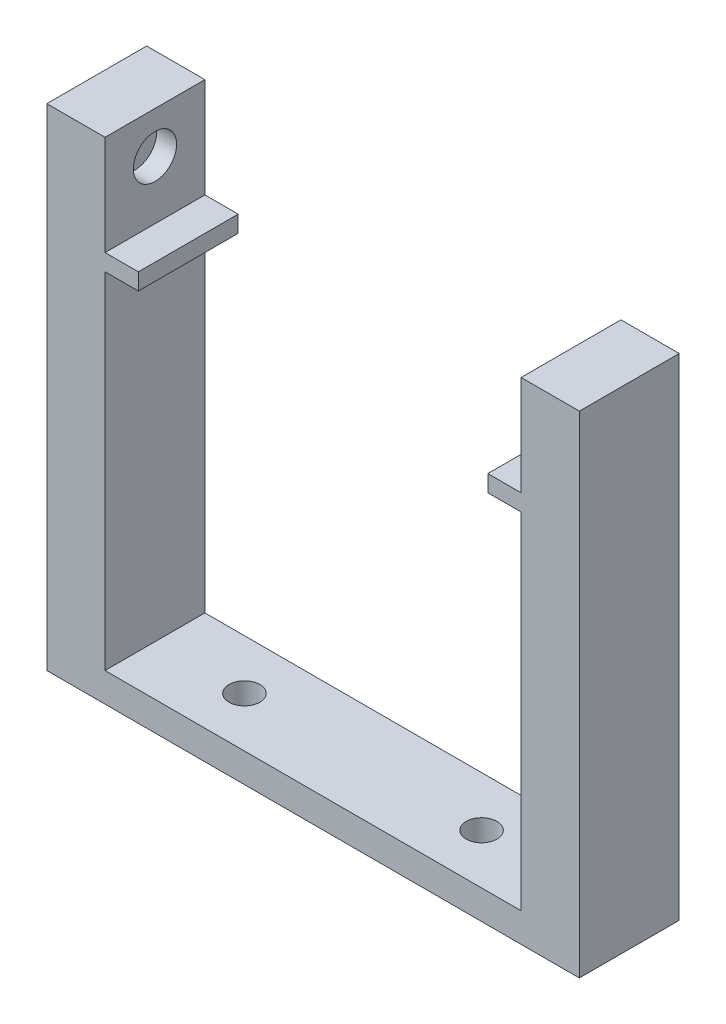
ISO-10303-21;
HEADER;
FILE_DESCRIPTION(('STEP AP214'),'2;1');
FILE_NAME('part.step','',(''),(''),'','','');
FILE_SCHEMA(('AUTOMOTIVE_DESIGN { 1 0 10303 214 1 1 1 1 }'));
ENDSEC;
DATA;
#1=APPLICATION_CONTEXT('core data for automotive mechanical design processes');
#2=APPLICATION_PROTOCOL_DEFINITION('international standard','automotive_design',2000,#1);
#3=PRODUCT_CONTEXT('',#1,'mechanical');
#4=PRODUCT('Part','Part','',(#3));
#5=PRODUCT_RELATED_PRODUCT_CATEGORY('part','',(#4));
#6=PRODUCT_DEFINITION_FORMATION('','',#4);
#7=PRODUCT_DEFINITION_CONTEXT('part definition',#1,'design');
#8=PRODUCT_DEFINITION('design','',#6,#7);
#9=PRODUCT_DEFINITION_SHAPE('','',#8);
#10=(LENGTH_UNIT() NAMED_UNIT(*) SI_UNIT(.MILLI.,.METRE.));
#11=(NAMED_UNIT(*) PLANE_ANGLE_UNIT() SI_UNIT($,.RADIAN.));
#12=(NAMED_UNIT(*) SI_UNIT($,.STERADIAN.) SOLID_ANGLE_UNIT());
#13=UNCERTAINTY_MEASURE_WITH_UNIT(LENGTH_MEASURE(1.E-05),#10,'distance_accuracy_value','');
#14=(GEOMETRIC_REPRESENTATION_CONTEXT(3) GLOBAL_UNCERTAINTY_ASSIGNED_CONTEXT((#13)) GLOBAL_UNIT_ASSIGNED_CONTEXT((#10,
#11,#12)) REPRESENTATION_CONTEXT('',''));
#15=CARTESIAN_POINT('',(0.,0.,0.));
#16=DIRECTION('',(0.,0.,1.));
#17=DIRECTION('',(1.,0.,0.));
#18=AXIS2_PLACEMENT_3D('',#15,#16,#17);
#19=CARTESIAN_POINT('',(7.,3.50000000000001,12.));
#20=DIRECTION('',(1.,0.,0.));
#21=DIRECTION('',(0.,0.,-1.));
#22=AXIS2_PLACEMENT_3D('',#19,#20,#21);
#23=PLANE('',#22);
#24=DIRECTION('',(0.,0.,-1.));
#25=VECTOR('',#24,1.);
#26=CARTESIAN_POINT('',(7.00000000000001,47.,0.));
#27=LINE('',#26,#25);
#28=CARTESIAN_POINT('',(7.,47.,12.));
#29=VERTEX_POINT('',#28);
#30=CARTESIAN_POINT('',(7.,47.,0.));
#31=VERTEX_POINT('',#30);
#32=EDGE_CURVE('E53',#29,#31,#27,.T.);
#33=ORIENTED_EDGE('',*,*,#32,.T.);
#34=DIRECTION('',(0.,-1.,0.));
#35=VECTOR('',#34,1.);
#36=CARTESIAN_POINT('',(7.,3.50000000000001,0.));
#37=LINE('',#36,#35);
#38=CARTESIAN_POINT('',(7.,59.,0.));
#39=VERTEX_POINT('',#38);
#40=EDGE_CURVE('E158',#39,#31,#37,.T.);
#41=ORIENTED_EDGE('',*,*,#40,.F.);
#42=DIRECTION('',(0.,0.,-1.));
#43=VECTOR('',#42,1.);
#44=CARTESIAN_POINT('',(7.,59.,0.));
#45=LINE('',#44,#43);
#46=CARTESIAN_POINT('',(7.,59.,12.));
#47=VERTEX_POINT('',#46);
#48=EDGE_CURVE('E225',#47,#39,#45,.T.);
#49=ORIENTED_EDGE('',*,*,#48,.F.);
#50=DIRECTION('',(0.,-1.,0.));
#51=VECTOR('',#50,1.);
#52=CARTESIAN_POINT('',(7.,3.50000000000001,12.));
#53=LINE('',#52,#51);
#54=EDGE_CURVE('E240',#47,#29,#53,.T.);
#55=ORIENTED_EDGE('',*,*,#54,.T.);
#56=EDGE_LOOP('',(#33,#41,#49,#55));
#57=FACE_BOUND('',#56,.T.);
#58=CARTESIAN_POINT('',(7.,54.,6.));
#59=DIRECTION('',(1.,0.,0.));
#60=DIRECTION('',(0.,0.,-1.));
#61=AXIS2_PLACEMENT_3D('',#58,#59,#60);
#62=CIRCLE('',#61,2.6);
#63=CARTESIAN_POINT('',(7.,54.,3.4));
#64=VERTEX_POINT('',#63);
#65=EDGE_CURVE('E214',#64,#64,#62,.T.);
#66=ORIENTED_EDGE('',*,*,#65,.F.);
#67=EDGE_LOOP('',(#66));
#68=FACE_BOUND('',#67,.T.);
#69=ADVANCED_FACE('F36',(#57,#68),#23,.T.);
#70=CARTESIAN_POINT('',(57.,3.5,12.));
#71=DIRECTION('',(-1.,0.,0.));
#72=DIRECTION('',(0.,0.,1.));
#73=AXIS2_PLACEMENT_3D('',#70,#71,#72);
#74=PLANE('',#73);
#75=DIRECTION('',(0.,1.,0.));
#76=VECTOR('',#75,1.);
#77=CARTESIAN_POINT('',(57.,3.5,12.));
#78=LINE('',#77,#76);
#79=CARTESIAN_POINT('',(57.,3.5,12.));
#80=VERTEX_POINT('',#79);
#81=CARTESIAN_POINT('',(57.,45.,12.));
#82=VERTEX_POINT('',#81);
#83=EDGE_CURVE('E235',#80,#82,#78,.T.);
#84=ORIENTED_EDGE('',*,*,#83,.T.);
#85=DIRECTION('',(0.,0.,1.));
#86=VECTOR('',#85,1.);
#87=CARTESIAN_POINT('',(57.,45.,0.));
#88=LINE('',#87,#86);
#89=CARTESIAN_POINT('',(57.,45.,0.));
#90=VERTEX_POINT('',#89);
#91=EDGE_CURVE('E161',#90,#82,#88,.T.);
#92=ORIENTED_EDGE('',*,*,#91,.F.);
#93=DIRECTION('',(0.,1.,0.));
#94=VECTOR('',#93,1.);
#95=CARTESIAN_POINT('',(57.,3.5,0.));
#96=LINE('',#95,#94);
#97=CARTESIAN_POINT('',(57.,3.5,0.));
#98=VERTEX_POINT('',#97);
#99=EDGE_CURVE('E245',#98,#90,#96,.T.);
#100=ORIENTED_EDGE('',*,*,#99,.F.);
#101=DIRECTION('',(0.,0.,-1.));
#102=VECTOR('',#101,1.);
#103=CARTESIAN_POINT('',(57.,3.5,12.));
#104=LINE('',#103,#102);
#105=EDGE_CURVE('E244',#80,#98,#104,.T.);
#106=ORIENTED_EDGE('',*,*,#105,.F.);
#107=EDGE_LOOP('',(#84,#92,#100,#106));
#108=FACE_BOUND('',#107,.T.);
#109=ADVANCED_FACE('F337',(#108),#74,.T.);
#110=CARTESIAN_POINT('',(57.,54.,6.));
#111=DIRECTION('',(1.,0.,0.));
#112=DIRECTION('',(0.,0.,-1.));
#113=AXIS2_PLACEMENT_3D('',#110,#111,#112);
#114=CIRCLE('',#113,2.6);
#115=CARTESIAN_POINT('',(57.,54.,3.4));
#116=VERTEX_POINT('',#115);
#117=EDGE_CURVE('E210',#116,#116,#114,.T.);
#118=ORIENTED_EDGE('',*,*,#117,.T.);
#119=EDGE_LOOP('',(#118));
#120=FACE_BOUND('',#119,.T.);
#121=CARTESIAN_POINT('',(57.,47.,0.));
#122=VERTEX_POINT('',#121);
#123=CARTESIAN_POINT('',(57.,59.,0.));
#124=VERTEX_POINT('',#123);
#125=EDGE_CURVE('E249',#122,#124,#96,.T.);
#126=ORIENTED_EDGE('',*,*,#125,.F.);
#127=DIRECTION('',(0.,0.,-1.));
#128=VECTOR('',#127,1.);
#129=CARTESIAN_POINT('',(57.,47.,0.));
#130=LINE('',#129,#128);
#131=CARTESIAN_POINT('',(57.,47.,12.));
#132=VERTEX_POINT('',#131);
#133=EDGE_CURVE('E192',#132,#122,#130,.T.);
#134=ORIENTED_EDGE('',*,*,#133,.F.);
#135=CARTESIAN_POINT('',(57.,59.,12.));
#136=VERTEX_POINT('',#135);
#137=EDGE_CURVE('E239',#132,#136,#78,.T.);
#138=ORIENTED_EDGE('',*,*,#137,.T.);
#139=DIRECTION('',(0.,0.,-1.));
#140=VECTOR('',#139,1.);
#141=CARTESIAN_POINT('',(57.,59.,0.));
#142=LINE('',#141,#140);
#143=EDGE_CURVE('E220',#136,#124,#142,.T.);
#144=ORIENTED_EDGE('',*,*,#143,.T.);
#145=EDGE_LOOP('',(#126,#134,#138,#144));
#146=FACE_BOUND('',#145,.T.);
#147=ADVANCED_FACE('F302',(#120,#146),#74,.T.);
#148=CARTESIAN_POINT('',(0.,0.,12.));
#149=DIRECTION('',(0.,0.,-1.));
#150=DIRECTION('',(-1.,0.,0.));
#151=AXIS2_PLACEMENT_3D('',#148,#149,#150);
#152=PLANE('',#151);
#153=ORIENTED_EDGE('',*,*,#54,.F.);
#154=DIRECTION('',(-1.,0.,0.));
#155=VECTOR('',#154,1.);
#156=CARTESIAN_POINT('',(0.,59.,12.));
#157=LINE('',#156,#155);
#158=CARTESIAN_POINT('',(0.,59.,12.));
#159=VERTEX_POINT('',#158);
#160=EDGE_CURVE('E268',#47,#159,#157,.T.);
#161=ORIENTED_EDGE('',*,*,#160,.T.);
#162=DIRECTION('',(0.,-1.,0.));
#163=VECTOR('',#162,1.);
#164=CARTESIAN_POINT('',(0.,0.,12.));
#165=LINE('',#164,#163);
#166=CARTESIAN_POINT('',(0.,0.,12.));
#167=VERTEX_POINT('',#166);
#168=EDGE_CURVE('E260',#159,#167,#165,.T.);
#169=ORIENTED_EDGE('',*,*,#168,.T.);
#170=DIRECTION('',(1.,0.,0.));
#171=VECTOR('',#170,1.);
#172=CARTESIAN_POINT('',(0.,0.,12.));
#173=LINE('',#172,#171);
#174=CARTESIAN_POINT('',(64.,0.,12.));
#175=VERTEX_POINT('',#174);
#176=EDGE_CURVE('E263',#167,#175,#173,.T.);
#177=ORIENTED_EDGE('',*,*,#176,.T.);
#178=DIRECTION('',(0.,1.,0.));
#179=VECTOR('',#178,1.);
#180=CARTESIAN_POINT('',(64.,0.,12.));
#181=LINE('',#180,#179);
#182=CARTESIAN_POINT('',(64.,59.,12.));
#183=VERTEX_POINT('',#182);
#184=EDGE_CURVE('E266',#175,#183,#181,.T.);
#185=ORIENTED_EDGE('',*,*,#184,.T.);
#186=EDGE_CURVE('E269',#183,#136,#157,.T.);
#187=ORIENTED_EDGE('',*,*,#186,.T.);
#188=ORIENTED_EDGE('',*,*,#137,.F.);
#189=DIRECTION('',(1.,0.,0.));
#190=VECTOR('',#189,1.);
#191=CARTESIAN_POINT('',(53.,47.,12.));
#192=LINE('',#191,#190);
#193=CARTESIAN_POINT('',(53.,47.,12.));
#194=VERTEX_POINT('',#193);
#195=EDGE_CURVE('E203',#194,#132,#192,.T.);
#196=ORIENTED_EDGE('',*,*,#195,.F.);
#197=DIRECTION('',(0.,1.,0.));
#198=VECTOR('',#197,1.);
#199=CARTESIAN_POINT('',(53.,47.,12.));
#200=LINE('',#199,#198);
#201=CARTESIAN_POINT('',(53.,45.,12.));
#202=VERTEX_POINT('',#201);
#203=EDGE_CURVE('E194',#202,#194,#200,.T.);
#204=ORIENTED_EDGE('',*,*,#203,.F.);
#205=DIRECTION('',(1.,0.,0.));
#206=VECTOR('',#205,1.);
#207=CARTESIAN_POINT('',(53.,45.,12.));
#208=LINE('',#207,#206);
#209=EDGE_CURVE('E205',#202,#82,#208,.T.);
#210=ORIENTED_EDGE('',*,*,#209,.T.);
#211=ORIENTED_EDGE('',*,*,#83,.F.);
#212=DIRECTION('',(1.,0.,0.));
#213=VECTOR('',#212,1.);
#214=CARTESIAN_POINT('',(7.,3.50000000000001,12.));
#215=LINE('',#214,#213);
#216=CARTESIAN_POINT('',(7.,3.50000000000001,12.));
#217=VERTEX_POINT('',#216);
#218=EDGE_CURVE('E242',#217,#80,#215,.T.);
#219=ORIENTED_EDGE('',*,*,#218,.F.);
#220=CARTESIAN_POINT('',(7.,45.,12.));
#221=VERTEX_POINT('',#220);
#222=EDGE_CURVE('E238',#221,#217,#53,.T.);
#223=ORIENTED_EDGE('',*,*,#222,.F.);
#224=DIRECTION('',(-1.,0.,0.));
#225=VECTOR('',#224,1.);
#226=CARTESIAN_POINT('',(11.,45.,12.));
#227=LINE('',#226,#225);
#228=CARTESIAN_POINT('',(11.,45.,12.));
#229=VERTEX_POINT('',#228);
#230=EDGE_CURVE('E184',#229,#221,#227,.T.);
#231=ORIENTED_EDGE('',*,*,#230,.F.);
#232=DIRECTION('',(0.,1.,0.));
#233=VECTOR('',#232,1.);
#234=CARTESIAN_POINT('',(11.,47.,12.));
#235=LINE('',#234,#233);
#236=CARTESIAN_POINT('',(11.,47.,12.));
#237=VERTEX_POINT('',#236);
#238=EDGE_CURVE('E175',#229,#237,#235,.T.);
#239=ORIENTED_EDGE('',*,*,#238,.T.);
#240=DIRECTION('',(-1.,0.,0.));
#241=VECTOR('',#240,1.);
#242=CARTESIAN_POINT('',(11.,47.,12.));
#243=LINE('',#242,#241);
#244=EDGE_CURVE('E162',#237,#29,#243,.T.);
#245=ORIENTED_EDGE('',*,*,#244,.T.);
#246=EDGE_LOOP('',(#153,#161,#169,#177,#185,#187,#188,#196,#204,#210,#211,#219,#223,#231,#239,#245));
#247=FACE_BOUND('',#246,.T.);
#248=ADVANCED_FACE('F325',(#247),#152,.F.);
#249=CARTESIAN_POINT('',(0.,0.,0.));
#250=DIRECTION('',(0.,0.,-1.));
#251=DIRECTION('',(-1.,0.,0.));
#252=AXIS2_PLACEMENT_3D('',#249,#250,#251);
#253=PLANE('',#252);
#254=DIRECTION('',(-1.,0.,0.));
#255=VECTOR('',#254,1.);
#256=CARTESIAN_POINT('',(0.,59.,0.));
#257=LINE('',#256,#255);
#258=CARTESIAN_POINT('',(0.,59.,0.));
#259=VERTEX_POINT('',#258);
#260=EDGE_CURVE('E279',#39,#259,#257,.T.);
#261=ORIENTED_EDGE('',*,*,#260,.F.);
#262=ORIENTED_EDGE('',*,*,#40,.T.);
#263=DIRECTION('',(-1.,0.,0.));
#264=VECTOR('',#263,1.);
#265=CARTESIAN_POINT('',(11.,47.,0.));
#266=LINE('',#265,#264);
#267=CARTESIAN_POINT('',(11.,47.,0.));
#268=VERTEX_POINT('',#267);
#269=EDGE_CURVE('E151',#268,#31,#266,.T.);
#270=ORIENTED_EDGE('',*,*,#269,.F.);
#271=DIRECTION('',(0.,-1.,0.));
#272=VECTOR('',#271,1.);
#273=CARTESIAN_POINT('',(11.,47.,0.));
#274=LINE('',#273,#272);
#275=CARTESIAN_POINT('',(11.,45.,0.));
#276=VERTEX_POINT('',#275);
#277=EDGE_CURVE('E156',#268,#276,#274,.T.);
#278=ORIENTED_EDGE('',*,*,#277,.T.);
#279=DIRECTION('',(-1.,0.,0.));
#280=VECTOR('',#279,1.);
#281=CARTESIAN_POINT('',(11.,45.,0.));
#282=LINE('',#281,#280);
#283=CARTESIAN_POINT('',(7.00000000000001,45.,0.));
#284=VERTEX_POINT('',#283);
#285=EDGE_CURVE('E180',#276,#284,#282,.T.);
#286=ORIENTED_EDGE('',*,*,#285,.T.);
#287=CARTESIAN_POINT('',(7.,3.50000000000001,0.));
#288=VERTEX_POINT('',#287);
#289=EDGE_CURVE('E248',#284,#288,#37,.T.);
#290=ORIENTED_EDGE('',*,*,#289,.T.);
#291=DIRECTION('',(1.,0.,0.));
#292=VECTOR('',#291,1.);
#293=CARTESIAN_POINT('',(7.,3.50000000000001,0.));
#294=LINE('',#293,#292);
#295=EDGE_CURVE('E251',#288,#98,#294,.T.);
#296=ORIENTED_EDGE('',*,*,#295,.T.);
#297=ORIENTED_EDGE('',*,*,#99,.T.);
#298=DIRECTION('',(1.,0.,0.));
#299=VECTOR('',#298,1.);
#300=CARTESIAN_POINT('',(53.,45.,0.));
#301=LINE('',#300,#299);
#302=CARTESIAN_POINT('',(53.,45.,0.));
#303=VERTEX_POINT('',#302);
#304=EDGE_CURVE('E208',#303,#90,#301,.T.);
#305=ORIENTED_EDGE('',*,*,#304,.F.);
#306=DIRECTION('',(0.,-1.,0.));
#307=VECTOR('',#306,1.);
#308=CARTESIAN_POINT('',(53.,47.,0.));
#309=LINE('',#308,#307);
#310=CARTESIAN_POINT('',(53.,47.,0.));
#311=VERTEX_POINT('',#310);
#312=EDGE_CURVE('E188',#311,#303,#309,.T.);
#313=ORIENTED_EDGE('',*,*,#312,.F.);
#314=DIRECTION('',(1.,0.,0.));
#315=VECTOR('',#314,1.);
#316=CARTESIAN_POINT('',(53.,47.,0.));
#317=LINE('',#316,#315);
#318=EDGE_CURVE('E198',#311,#122,#317,.T.);
#319=ORIENTED_EDGE('',*,*,#318,.T.);
#320=ORIENTED_EDGE('',*,*,#125,.T.);
#321=CARTESIAN_POINT('',(64.,59.,0.));
#322=VERTEX_POINT('',#321);
#323=EDGE_CURVE('E264',#322,#124,#257,.T.);
#324=ORIENTED_EDGE('',*,*,#323,.F.);
#325=DIRECTION('',(0.,1.,0.));
#326=VECTOR('',#325,1.);
#327=CARTESIAN_POINT('',(64.,0.,0.));
#328=LINE('',#327,#326);
#329=CARTESIAN_POINT('',(64.,0.,0.));
#330=VERTEX_POINT('',#329);
#331=EDGE_CURVE('E277',#330,#322,#328,.T.);
#332=ORIENTED_EDGE('',*,*,#331,.F.);
#333=DIRECTION('',(1.,0.,0.));
#334=VECTOR('',#333,1.);
#335=CARTESIAN_POINT('',(0.,0.,0.));
#336=LINE('',#335,#334);
#337=CARTESIAN_POINT('',(0.,0.,0.));
#338=VERTEX_POINT('',#337);
#339=EDGE_CURVE('E275',#338,#330,#336,.T.);
#340=ORIENTED_EDGE('',*,*,#339,.F.);
#341=DIRECTION('',(0.,-1.,0.));
#342=VECTOR('',#341,1.);
#343=CARTESIAN_POINT('',(0.,0.,0.));
#344=LINE('',#343,#342);
#345=EDGE_CURVE('E259',#259,#338,#344,.T.);
#346=ORIENTED_EDGE('',*,*,#345,.F.);
#347=EDGE_LOOP('',(#261,#262,#270,#278,#286,#290,#296,#297,#305,#313,#319,#320,#324,#332,#340,#346));
#348=FACE_BOUND('',#347,.T.);
#349=ADVANCED_FACE('F154',(#348),#253,.T.);
#350=CARTESIAN_POINT('',(0.,59.,12.));
#351=DIRECTION('',(0.,-1.,0.));
#352=DIRECTION('',(0.,0.,-1.));
#353=AXIS2_PLACEMENT_3D('',#350,#351,#352);
#354=PLANE('',#353);
#355=ORIENTED_EDGE('',*,*,#48,.T.);
#356=ORIENTED_EDGE('',*,*,#260,.T.);
#357=DIRECTION('',(0.,0.,-1.));
#358=VECTOR('',#357,1.);
#359=CARTESIAN_POINT('',(0.,59.,12.));
#360=LINE('',#359,#358);
#361=EDGE_CURVE('E272',#159,#259,#360,.T.);
#362=ORIENTED_EDGE('',*,*,#361,.F.);
#363=ORIENTED_EDGE('',*,*,#160,.F.);
#364=EDGE_LOOP('',(#355,#356,#362,#363));
#365=FACE_BOUND('',#364,.T.);
#366=ADVANCED_FACE('F321',(#365),#354,.F.);
#367=CARTESIAN_POINT('',(0.,0.,12.));
#368=DIRECTION('',(1.,0.,0.));
#369=DIRECTION('',(0.,0.,-1.));
#370=AXIS2_PLACEMENT_3D('',#367,#368,#369);
#371=PLANE('',#370);
#372=ORIENTED_EDGE('',*,*,#345,.T.);
#373=DIRECTION('',(0.,0.,-1.));
#374=VECTOR('',#373,1.);
#375=CARTESIAN_POINT('',(0.,0.,12.));
#376=LINE('',#375,#374);
#377=EDGE_CURVE('E11',#167,#338,#376,.T.);
#378=ORIENTED_EDGE('',*,*,#377,.F.);
#379=ORIENTED_EDGE('',*,*,#168,.F.);
#380=ORIENTED_EDGE('',*,*,#361,.T.);
#381=EDGE_LOOP('',(#372,#378,#379,#380));
#382=FACE_BOUND('',#381,.T.);
#383=ADVANCED_FACE('F38',(#382),#371,.F.);
#384=CARTESIAN_POINT('',(0.,0.,12.));
#385=DIRECTION('',(0.,1.,0.));
#386=DIRECTION('',(0.,0.,1.));
#387=AXIS2_PLACEMENT_3D('',#384,#385,#386);
#388=PLANE('',#387);
#389=CARTESIAN_POINT('',(17.75,0.,6.));
#390=DIRECTION('',(0.,-1.,0.));
#391=DIRECTION('',(0.,0.,-1.));
#392=AXIS2_PLACEMENT_3D('',#389,#390,#391);
#393=CIRCLE('',#392,1.85);
#394=CARTESIAN_POINT('',(17.75,0.,4.15));
#395=VERTEX_POINT('',#394);
#396=EDGE_CURVE('E229',#395,#395,#393,.T.);
#397=ORIENTED_EDGE('',*,*,#396,.F.);
#398=EDGE_LOOP('',(#397));
#399=FACE_BOUND('',#398,.T.);
#400=CARTESIAN_POINT('',(46.25,0.,6.));
#401=DIRECTION('',(0.,-1.,0.));
#402=DIRECTION('',(0.,0.,1.));
#403=AXIS2_PLACEMENT_3D('',#400,#401,#402);
#404=CIRCLE('',#403,1.85);
#405=CARTESIAN_POINT('',(46.25,0.,7.85));
#406=VERTEX_POINT('',#405);
#407=EDGE_CURVE('E228',#406,#406,#404,.T.);
#408=ORIENTED_EDGE('',*,*,#407,.F.);
#409=EDGE_LOOP('',(#408));
#410=FACE_BOUND('',#409,.T.);
#411=ORIENTED_EDGE('',*,*,#339,.T.);
#412=DIRECTION('',(0.,0.,-1.));
#413=VECTOR('',#412,1.);
#414=CARTESIAN_POINT('',(64.,0.,12.));
#415=LINE('',#414,#413);
#416=EDGE_CURVE('E45',#175,#330,#415,.T.);
#417=ORIENTED_EDGE('',*,*,#416,.F.);
#418=ORIENTED_EDGE('',*,*,#176,.F.);
#419=ORIENTED_EDGE('',*,*,#377,.T.);
#420=EDGE_LOOP('',(#411,#417,#418,#419));
#421=FACE_BOUND('',#420,.T.);
#422=ADVANCED_FACE('F315',(#399,#410,#421),#388,.F.);
#423=CARTESIAN_POINT('',(64.,0.,12.));
#424=DIRECTION('',(-1.,0.,0.));
#425=DIRECTION('',(0.,0.,1.));
#426=AXIS2_PLACEMENT_3D('',#423,#424,#425);
#427=PLANE('',#426);
#428=ORIENTED_EDGE('',*,*,#331,.T.);
#429=DIRECTION('',(0.,0.,-1.));
#430=VECTOR('',#429,1.);
#431=CARTESIAN_POINT('',(64.,59.,12.));
#432=LINE('',#431,#430);
#433=EDGE_CURVE('E284',#183,#322,#432,.T.);
#434=ORIENTED_EDGE('',*,*,#433,.F.);
#435=ORIENTED_EDGE('',*,*,#184,.F.);
#436=ORIENTED_EDGE('',*,*,#416,.T.);
#437=EDGE_LOOP('',(#428,#434,#435,#436));
#438=FACE_BOUND('',#437,.T.);
#439=ADVANCED_FACE('F310',(#438),#427,.F.);
#440=ORIENTED_EDGE('',*,*,#323,.T.);
#441=ORIENTED_EDGE('',*,*,#143,.F.);
#442=ORIENTED_EDGE('',*,*,#186,.F.);
#443=ORIENTED_EDGE('',*,*,#433,.T.);
#444=EDGE_LOOP('',(#440,#441,#442,#443));
#445=FACE_BOUND('',#444,.T.);
#446=ADVANCED_FACE('F306',(#445),#354,.F.);
#447=DIRECTION('',(0.,0.,1.));
#448=VECTOR('',#447,1.);
#449=CARTESIAN_POINT('',(7.00000000000001,45.,0.));
#450=LINE('',#449,#448);
#451=EDGE_CURVE('E61',#284,#221,#450,.T.);
#452=ORIENTED_EDGE('',*,*,#451,.T.);
#453=ORIENTED_EDGE('',*,*,#222,.T.);
#454=DIRECTION('',(0.,0.,-1.));
#455=VECTOR('',#454,1.);
#456=CARTESIAN_POINT('',(7.,3.50000000000001,12.));
#457=LINE('',#456,#455);
#458=EDGE_CURVE('E256',#217,#288,#457,.T.);
#459=ORIENTED_EDGE('',*,*,#458,.T.);
#460=ORIENTED_EDGE('',*,*,#289,.F.);
#461=EDGE_LOOP('',(#452,#453,#459,#460));
#462=FACE_BOUND('',#461,.T.);
#463=ADVANCED_FACE('F330',(#462),#23,.T.);
#464=CARTESIAN_POINT('',(7.,3.50000000000001,12.));
#465=DIRECTION('',(0.,1.,0.));
#466=DIRECTION('',(-1.,0.,0.));
#467=AXIS2_PLACEMENT_3D('',#464,#465,#466);
#468=PLANE('',#467);
#469=CARTESIAN_POINT('',(17.75,3.5,6.));
#470=DIRECTION('',(0.,1.,0.));
#471=DIRECTION('',(-1.,0.,0.));
#472=AXIS2_PLACEMENT_3D('',#469,#470,#471);
#473=CIRCLE('',#472,1.85);
#474=CARTESIAN_POINT('',(15.9,3.5,6.));
#475=VERTEX_POINT('',#474);
#476=EDGE_CURVE('E40',#475,#475,#473,.T.);
#477=ORIENTED_EDGE('',*,*,#476,.F.);
#478=EDGE_LOOP('',(#477));
#479=FACE_BOUND('',#478,.T.);
#480=CARTESIAN_POINT('',(46.25,3.5,6.));
#481=DIRECTION('',(0.,1.,0.));
#482=DIRECTION('',(-1.,0.,0.));
#483=AXIS2_PLACEMENT_3D('',#480,#481,#482);
#484=CIRCLE('',#483,1.85);
#485=CARTESIAN_POINT('',(44.4,3.5,6.));
#486=VERTEX_POINT('',#485);
#487=EDGE_CURVE('E232',#486,#486,#484,.T.);
#488=ORIENTED_EDGE('',*,*,#487,.F.);
#489=EDGE_LOOP('',(#488));
#490=FACE_BOUND('',#489,.T.);
#491=ORIENTED_EDGE('',*,*,#295,.F.);
#492=ORIENTED_EDGE('',*,*,#458,.F.);
#493=ORIENTED_EDGE('',*,*,#218,.T.);
#494=ORIENTED_EDGE('',*,*,#105,.T.);
#495=EDGE_LOOP('',(#491,#492,#493,#494));
#496=FACE_BOUND('',#495,.T.);
#497=ADVANCED_FACE('F333',(#479,#490,#496),#468,.T.);
#498=CARTESIAN_POINT('',(46.25,10.,6.));
#499=DIRECTION('',(0.,-1.,0.));
#500=DIRECTION('',(0.,0.,-1.));
#501=AXIS2_PLACEMENT_3D('',#498,#499,#500);
#502=CYLINDRICAL_SURFACE('',#501,1.85);
#503=ORIENTED_EDGE('',*,*,#487,.T.);
#504=EDGE_LOOP('',(#503));
#505=FACE_BOUND('',#504,.T.);
#506=ORIENTED_EDGE('',*,*,#407,.T.);
#507=EDGE_LOOP('',(#506));
#508=FACE_BOUND('',#507,.T.);
#509=ADVANCED_FACE('F371',(#505,#508),#502,.F.);
#510=CARTESIAN_POINT('',(17.75,10.,6.));
#511=DIRECTION('',(0.,-1.,0.));
#512=DIRECTION('',(0.,0.,-1.));
#513=AXIS2_PLACEMENT_3D('',#510,#511,#512);
#514=CYLINDRICAL_SURFACE('',#513,1.85);
#515=ORIENTED_EDGE('',*,*,#476,.T.);
#516=EDGE_LOOP('',(#515));
#517=FACE_BOUND('',#516,.T.);
#518=ORIENTED_EDGE('',*,*,#396,.T.);
#519=EDGE_LOOP('',(#518));
#520=FACE_BOUND('',#519,.T.);
#521=ADVANCED_FACE('F413',(#517,#520),#514,.F.);
#522=CARTESIAN_POINT('',(4.6,54.,6.));
#523=DIRECTION('',(1.,0.,0.));
#524=DIRECTION('',(0.,0.,-1.));
#525=AXIS2_PLACEMENT_3D('',#522,#523,#524);
#526=CYLINDRICAL_SURFACE('',#525,2.6);
#527=CARTESIAN_POINT('',(4.6,54.,6.));
#528=DIRECTION('',(1.,0.,0.));
#529=DIRECTION('',(0.,0.,-1.));
#530=AXIS2_PLACEMENT_3D('',#527,#528,#529);
#531=CIRCLE('',#530,2.6);
#532=CARTESIAN_POINT('',(4.6,54.,3.4));
#533=VERTEX_POINT('',#532);
#534=EDGE_CURVE('E217',#533,#533,#531,.T.);
#535=ORIENTED_EDGE('',*,*,#534,.F.);
#536=EDGE_LOOP('',(#535));
#537=FACE_BOUND('',#536,.T.);
#538=ORIENTED_EDGE('',*,*,#65,.T.);
#539=EDGE_LOOP('',(#538));
#540=FACE_BOUND('',#539,.T.);
#541=ADVANCED_FACE('F407',(#537,#540),#526,.F.);
#542=CARTESIAN_POINT('',(4.6,54.,6.));
#543=DIRECTION('',(1.,0.,0.));
#544=DIRECTION('',(0.,0.,-1.));
#545=AXIS2_PLACEMENT_3D('',#542,#543,#544);
#546=PLANE('',#545);
#547=ORIENTED_EDGE('',*,*,#534,.T.);
#548=EDGE_LOOP('',(#547));
#549=FACE_BOUND('',#548,.T.);
#550=ADVANCED_FACE('F398',(#549),#546,.T.);
#551=CARTESIAN_POINT('',(59.4,54.,6.));
#552=DIRECTION('',(-1.,0.,0.));
#553=DIRECTION('',(0.,0.,1.));
#554=AXIS2_PLACEMENT_3D('',#551,#552,#553);
#555=CYLINDRICAL_SURFACE('',#554,2.6);
#556=CARTESIAN_POINT('',(59.4,54.,6.));
#557=DIRECTION('',(1.,0.,0.));
#558=DIRECTION('',(0.,0.,-1.));
#559=AXIS2_PLACEMENT_3D('',#556,#557,#558);
#560=CIRCLE('',#559,2.6);
#561=CARTESIAN_POINT('',(59.4,54.,3.4));
#562=VERTEX_POINT('',#561);
#563=EDGE_CURVE('E211',#562,#562,#560,.T.);
#564=ORIENTED_EDGE('',*,*,#563,.T.);
#565=EDGE_LOOP('',(#564));
#566=FACE_BOUND('',#565,.T.);
#567=ORIENTED_EDGE('',*,*,#117,.F.);
#568=EDGE_LOOP('',(#567));
#569=FACE_BOUND('',#568,.T.);
#570=ADVANCED_FACE('F396',(#566,#569),#555,.F.);
#571=CARTESIAN_POINT('',(59.4,54.,6.));
#572=DIRECTION('',(-1.,0.,0.));
#573=DIRECTION('',(0.,0.,-1.));
#574=AXIS2_PLACEMENT_3D('',#571,#572,#573);
#575=PLANE('',#574);
#576=ORIENTED_EDGE('',*,*,#563,.F.);
#577=EDGE_LOOP('',(#576));
#578=FACE_BOUND('',#577,.T.);
#579=ADVANCED_FACE('F357',(#578),#575,.T.);
#580=CARTESIAN_POINT('',(53.,45.,0.));
#581=DIRECTION('',(0.,1.,0.));
#582=DIRECTION('',(0.,0.,1.));
#583=AXIS2_PLACEMENT_3D('',#580,#581,#582);
#584=PLANE('',#583);
#585=ORIENTED_EDGE('',*,*,#91,.T.);
#586=ORIENTED_EDGE('',*,*,#209,.F.);
#587=DIRECTION('',(0.,0.,1.));
#588=VECTOR('',#587,1.);
#589=CARTESIAN_POINT('',(53.,45.,0.));
#590=LINE('',#589,#588);
#591=EDGE_CURVE('E191',#303,#202,#590,.T.);
#592=ORIENTED_EDGE('',*,*,#591,.F.);
#593=ORIENTED_EDGE('',*,*,#304,.T.);
#594=EDGE_LOOP('',(#585,#586,#592,#593));
#595=FACE_BOUND('',#594,.T.);
#596=ADVANCED_FACE('F343',(#595),#584,.F.);
#597=CARTESIAN_POINT('',(53.,47.,0.));
#598=DIRECTION('',(0.,-1.,0.));
#599=DIRECTION('',(0.,0.,-1.));
#600=AXIS2_PLACEMENT_3D('',#597,#598,#599);
#601=PLANE('',#600);
#602=ORIENTED_EDGE('',*,*,#133,.T.);
#603=ORIENTED_EDGE('',*,*,#318,.F.);
#604=DIRECTION('',(0.,0.,-1.));
#605=VECTOR('',#604,1.);
#606=CARTESIAN_POINT('',(53.,47.,0.));
#607=LINE('',#606,#605);
#608=EDGE_CURVE('E196',#194,#311,#607,.T.);
#609=ORIENTED_EDGE('',*,*,#608,.F.);
#610=ORIENTED_EDGE('',*,*,#195,.T.);
#611=EDGE_LOOP('',(#602,#603,#609,#610));
#612=FACE_BOUND('',#611,.T.);
#613=ADVANCED_FACE('F349',(#612),#601,.F.);
#614=CARTESIAN_POINT('',(53.,0.,0.));
#615=DIRECTION('',(-1.,0.,0.));
#616=DIRECTION('',(0.,0.,1.));
#617=AXIS2_PLACEMENT_3D('',#614,#615,#616);
#618=PLANE('',#617);
#619=ORIENTED_EDGE('',*,*,#312,.T.);
#620=ORIENTED_EDGE('',*,*,#591,.T.);
#621=ORIENTED_EDGE('',*,*,#203,.T.);
#622=ORIENTED_EDGE('',*,*,#608,.T.);
#623=EDGE_LOOP('',(#619,#620,#621,#622));
#624=FACE_BOUND('',#623,.T.);
#625=ADVANCED_FACE('F346',(#624),#618,.T.);
#626=CARTESIAN_POINT('',(11.,47.,0.));
#627=DIRECTION('',(0.,1.,0.));
#628=DIRECTION('',(0.,0.,1.));
#629=AXIS2_PLACEMENT_3D('',#626,#627,#628);
#630=PLANE('',#629);
#631=ORIENTED_EDGE('',*,*,#32,.F.);
#632=ORIENTED_EDGE('',*,*,#244,.F.);
#633=DIRECTION('',(0.,0.,-1.));
#634=VECTOR('',#633,1.);
#635=CARTESIAN_POINT('',(11.,47.,0.));
#636=LINE('',#635,#634);
#637=EDGE_CURVE('E168',#237,#268,#636,.T.);
#638=ORIENTED_EDGE('',*,*,#637,.T.);
#639=ORIENTED_EDGE('',*,*,#269,.T.);
#640=EDGE_LOOP('',(#631,#632,#638,#639));
#641=FACE_BOUND('',#640,.T.);
#642=ADVANCED_FACE('F173',(#641),#630,.T.);
#643=CARTESIAN_POINT('',(11.,45.,0.));
#644=DIRECTION('',(0.,-1.,0.));
#645=DIRECTION('',(0.,0.,-1.));
#646=AXIS2_PLACEMENT_3D('',#643,#644,#645);
#647=PLANE('',#646);
#648=ORIENTED_EDGE('',*,*,#451,.F.);
#649=ORIENTED_EDGE('',*,*,#285,.F.);
#650=DIRECTION('',(0.,0.,1.));
#651=VECTOR('',#650,1.);
#652=CARTESIAN_POINT('',(11.,45.,0.));
#653=LINE('',#652,#651);
#654=EDGE_CURVE('E171',#276,#229,#653,.T.);
#655=ORIENTED_EDGE('',*,*,#654,.T.);
#656=ORIENTED_EDGE('',*,*,#230,.T.);
#657=EDGE_LOOP('',(#648,#649,#655,#656));
#658=FACE_BOUND('',#657,.T.);
#659=ADVANCED_FACE('F327',(#658),#647,.T.);
#660=CARTESIAN_POINT('',(11.,0.,0.));
#661=DIRECTION('',(1.,0.,0.));
#662=DIRECTION('',(0.,0.,1.));
#663=AXIS2_PLACEMENT_3D('',#660,#661,#662);
#664=PLANE('',#663);
#665=ORIENTED_EDGE('',*,*,#277,.F.);
#666=ORIENTED_EDGE('',*,*,#637,.F.);
#667=ORIENTED_EDGE('',*,*,#238,.F.);
#668=ORIENTED_EDGE('',*,*,#654,.F.);
#669=EDGE_LOOP('',(#665,#666,#667,#668));
#670=FACE_BOUND('',#669,.T.);
#671=ADVANCED_FACE('F166',(#670),#664,.T.);
#672=CLOSED_SHELL('',(#69,#109,#147,#248,#349,#366,#383,#422,#439,#446,#463,#497,#509,#521,#541,
#550,#570,#579,#596,#613,#625,#642,#659,#671));
#673=MANIFOLD_SOLID_BREP('B2',#672);
#674=ADVANCED_BREP_SHAPE_REPRESENTATION('',(#18,#673),#14);
#675=SHAPE_DEFINITION_REPRESENTATION(#9,#674);
ENDSEC;
END-ISO-10303-21;
